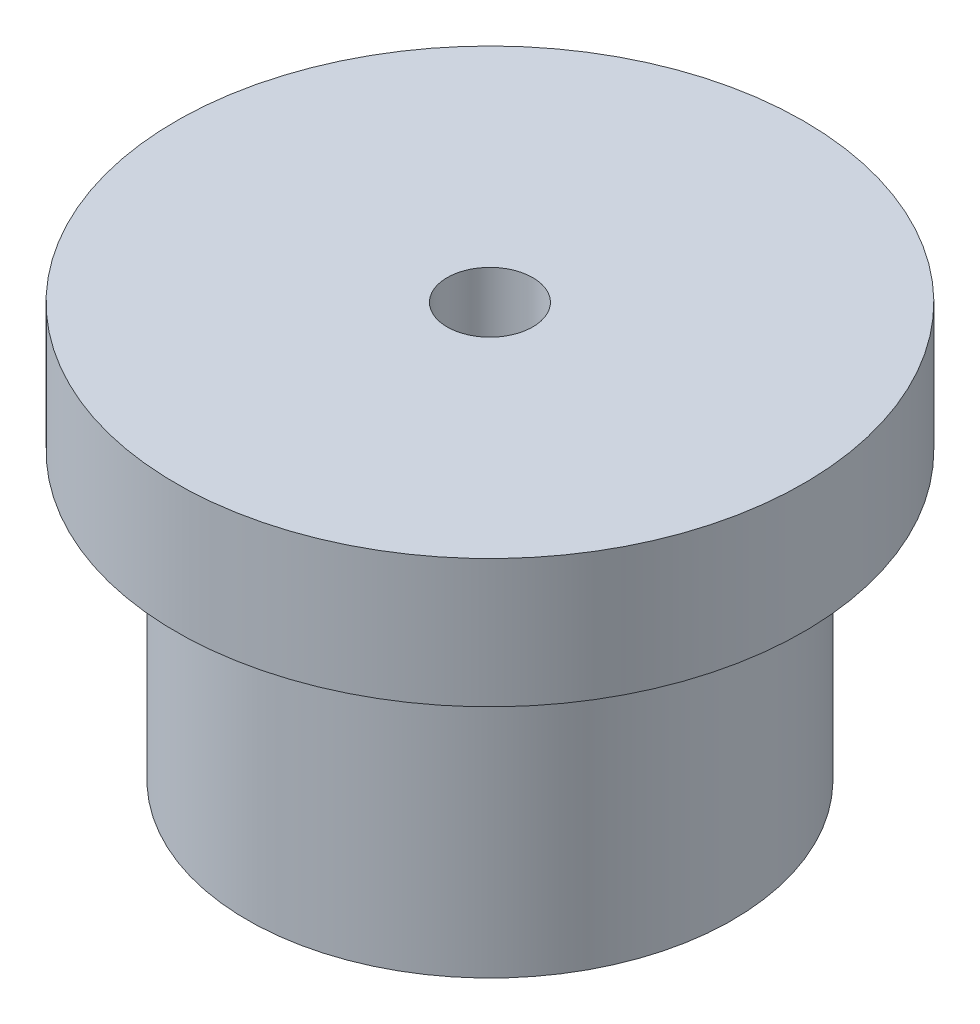
ISO-10303-21;
HEADER;
FILE_DESCRIPTION(('STEP AP214'),'2;1');
FILE_NAME('part.step','',(''),(''),'','','');
FILE_SCHEMA(('AUTOMOTIVE_DESIGN { 1 0 10303 214 1 1 1 1 }'));
ENDSEC;
DATA;
#1=APPLICATION_CONTEXT('core data for automotive mechanical design processes');
#2=APPLICATION_PROTOCOL_DEFINITION('international standard','automotive_design',2000,#1);
#3=PRODUCT_CONTEXT('',#1,'mechanical');
#4=PRODUCT('Part','Part','',(#3));
#5=PRODUCT_RELATED_PRODUCT_CATEGORY('part','',(#4));
#6=PRODUCT_DEFINITION_FORMATION('','',#4);
#7=PRODUCT_DEFINITION_CONTEXT('part definition',#1,'design');
#8=PRODUCT_DEFINITION('design','',#6,#7);
#9=PRODUCT_DEFINITION_SHAPE('','',#8);
#10=(LENGTH_UNIT() NAMED_UNIT(*) SI_UNIT(.MILLI.,.METRE.));
#11=(NAMED_UNIT(*) PLANE_ANGLE_UNIT() SI_UNIT($,.RADIAN.));
#12=(NAMED_UNIT(*) SI_UNIT($,.STERADIAN.) SOLID_ANGLE_UNIT());
#13=UNCERTAINTY_MEASURE_WITH_UNIT(LENGTH_MEASURE(1.E-05),#10,'distance_accuracy_value','');
#14=(GEOMETRIC_REPRESENTATION_CONTEXT(3) GLOBAL_UNCERTAINTY_ASSIGNED_CONTEXT((#13)) GLOBAL_UNIT_ASSIGNED_CONTEXT((#10,
#11,#12)) REPRESENTATION_CONTEXT('',''));
#15=CARTESIAN_POINT('',(0.,0.,0.));
#16=DIRECTION('',(0.,0.,1.));
#17=DIRECTION('',(1.,0.,0.));
#18=AXIS2_PLACEMENT_3D('',#15,#16,#17);
#19=CARTESIAN_POINT('',(0.,0.,0.));
#20=DIRECTION('',(0.,-1.,0.));
#21=DIRECTION('',(0.,0.,-1.));
#22=AXIS2_PLACEMENT_3D('',#19,#20,#21);
#23=CYLINDRICAL_SURFACE('',#22,15.);
#24=CARTESIAN_POINT('',(0.,-10.,0.));
#25=DIRECTION('',(0.,-1.,0.));
#26=DIRECTION('',(0.,0.,-1.));
#27=AXIS2_PLACEMENT_3D('',#24,#25,#26);
#28=CIRCLE('',#27,15.);
#29=CARTESIAN_POINT('',(0.,-10.,-15.));
#30=VERTEX_POINT('',#29);
#31=EDGE_CURVE('E10',#30,#30,#28,.T.);
#32=ORIENTED_EDGE('',*,*,#31,.T.);
#33=EDGE_LOOP('',(#32));
#34=FACE_BOUND('',#33,.T.);
#35=CARTESIAN_POINT('',(0.,135.,0.));
#36=DIRECTION('',(0.,-1.,0.));
#37=DIRECTION('',(0.,0.,-1.));
#38=AXIS2_PLACEMENT_3D('',#35,#36,#37);
#39=CIRCLE('',#38,15.);
#40=CARTESIAN_POINT('',(0.,135.,-15.));
#41=VERTEX_POINT('',#40);
#42=EDGE_CURVE('E58',#41,#41,#39,.T.);
#43=ORIENTED_EDGE('',*,*,#42,.F.);
#44=EDGE_LOOP('',(#43));
#45=FACE_BOUND('',#44,.T.);
#46=ADVANCED_FACE('F36',(#34,#45),#23,.F.);
#47=CARTESIAN_POINT('',(0.,-10.,0.));
#48=DIRECTION('',(0.,-1.,0.));
#49=DIRECTION('',(0.,0.,-1.));
#50=AXIS2_PLACEMENT_3D('',#47,#48,#49);
#51=PLANE('',#50);
#52=CARTESIAN_POINT('',(0.,-10.,0.));
#53=DIRECTION('',(0.,-1.,0.));
#54=DIRECTION('',(0.,0.,-1.));
#55=AXIS2_PLACEMENT_3D('',#52,#53,#54);
#56=CIRCLE('',#55,85.);
#57=CARTESIAN_POINT('',(0.,-10.,-85.));
#58=VERTEX_POINT('',#57);
#59=EDGE_CURVE('E42',#58,#58,#56,.T.);
#60=ORIENTED_EDGE('',*,*,#59,.T.);
#61=EDGE_LOOP('',(#60));
#62=FACE_BOUND('',#61,.T.);
#63=ORIENTED_EDGE('',*,*,#31,.F.);
#64=EDGE_LOOP('',(#63));
#65=FACE_BOUND('',#64,.T.);
#66=ADVANCED_FACE('F133',(#62,#65),#51,.T.);
#67=CARTESIAN_POINT('',(0.,0.,0.));
#68=DIRECTION('',(0.,-1.,0.));
#69=DIRECTION('',(0.,0.,-1.));
#70=AXIS2_PLACEMENT_3D('',#67,#68,#69);
#71=CYLINDRICAL_SURFACE('',#70,85.);
#72=CARTESIAN_POINT('',(0.,90.,0.));
#73=DIRECTION('',(0.,-1.,0.));
#74=DIRECTION('',(0.,0.,-1.));
#75=AXIS2_PLACEMENT_3D('',#72,#73,#74);
#76=CIRCLE('',#75,85.);
#77=CARTESIAN_POINT('',(0.,90.,-85.));
#78=VERTEX_POINT('',#77);
#79=EDGE_CURVE('E46',#78,#78,#76,.T.);
#80=ORIENTED_EDGE('',*,*,#79,.T.);
#81=EDGE_LOOP('',(#80));
#82=FACE_BOUND('',#81,.T.);
#83=ORIENTED_EDGE('',*,*,#59,.F.);
#84=EDGE_LOOP('',(#83));
#85=FACE_BOUND('',#84,.T.);
#86=ADVANCED_FACE('F130',(#82,#85),#71,.T.);
#87=CARTESIAN_POINT('',(0.,90.,0.));
#88=DIRECTION('',(0.,-1.,0.));
#89=DIRECTION('',(0.,0.,-1.));
#90=AXIS2_PLACEMENT_3D('',#87,#88,#89);
#91=PLANE('',#90);
#92=CARTESIAN_POINT('',(0.,90.,0.));
#93=DIRECTION('',(0.,-1.,0.));
#94=DIRECTION('',(0.,0.,-1.));
#95=AXIS2_PLACEMENT_3D('',#92,#93,#94);
#96=CIRCLE('',#95,110.);
#97=CARTESIAN_POINT('',(0.,90.,-110.));
#98=VERTEX_POINT('',#97);
#99=EDGE_CURVE('E50',#98,#98,#96,.T.);
#100=ORIENTED_EDGE('',*,*,#99,.T.);
#101=EDGE_LOOP('',(#100));
#102=FACE_BOUND('',#101,.T.);
#103=ORIENTED_EDGE('',*,*,#79,.F.);
#104=EDGE_LOOP('',(#103));
#105=FACE_BOUND('',#104,.T.);
#106=ADVANCED_FACE('F126',(#102,#105),#91,.T.);
#107=CARTESIAN_POINT('',(0.,0.,0.));
#108=DIRECTION('',(0.,-1.,0.));
#109=DIRECTION('',(0.,0.,-1.));
#110=AXIS2_PLACEMENT_3D('',#107,#108,#109);
#111=CYLINDRICAL_SURFACE('',#110,110.);
#112=CARTESIAN_POINT('',(0.,135.,0.));
#113=DIRECTION('',(0.,-1.,0.));
#114=DIRECTION('',(0.,0.,-1.));
#115=AXIS2_PLACEMENT_3D('',#112,#113,#114);
#116=CIRCLE('',#115,110.);
#117=CARTESIAN_POINT('',(0.,135.,-110.));
#118=VERTEX_POINT('',#117);
#119=EDGE_CURVE('E55',#118,#118,#116,.T.);
#120=ORIENTED_EDGE('',*,*,#119,.T.);
#121=EDGE_LOOP('',(#120));
#122=FACE_BOUND('',#121,.T.);
#123=ORIENTED_EDGE('',*,*,#99,.F.);
#124=EDGE_LOOP('',(#123));
#125=FACE_BOUND('',#124,.T.);
#126=ADVANCED_FACE('F122',(#122,#125),#111,.T.);
#127=CARTESIAN_POINT('',(0.,135.,0.));
#128=DIRECTION('',(0.,1.,0.));
#129=DIRECTION('',(0.,0.,1.));
#130=AXIS2_PLACEMENT_3D('',#127,#128,#129);
#131=PLANE('',#130);
#132=ORIENTED_EDGE('',*,*,#42,.T.);
#133=EDGE_LOOP('',(#132));
#134=FACE_BOUND('',#133,.T.);
#135=ORIENTED_EDGE('',*,*,#119,.F.);
#136=EDGE_LOOP('',(#135));
#137=FACE_BOUND('',#136,.T.);
#138=ADVANCED_FACE('F120',(#134,#137),#131,.T.);
#139=CLOSED_SHELL('',(#46,#66,#86,#106,#126,#138));
#140=CARTESIAN_POINT('',(0.,0.,0.));
#141=DIRECTION('',(0.,-1.,0.));
#142=DIRECTION('',(0.,0.,-1.));
#143=AXIS2_PLACEMENT_3D('',#140,#141,#142);
#144=CYLINDRICAL_SURFACE('',#143,25.);
#145=CARTESIAN_POINT('',(0.,0.,0.));
#146=DIRECTION('',(0.,-1.,0.));
#147=DIRECTION('',(0.,0.,-1.));
#148=AXIS2_PLACEMENT_3D('',#145,#146,#147);
#149=CIRCLE('',#148,25.);
#150=CARTESIAN_POINT('',(0.,0.,-25.));
#151=VERTEX_POINT('',#150);
#152=EDGE_CURVE('E61',#151,#151,#149,.T.);
#153=ORIENTED_EDGE('',*,*,#152,.F.);
#154=EDGE_LOOP('',(#153));
#155=FACE_BOUND('',#154,.T.);
#156=CARTESIAN_POINT('',(0.,125.,0.));
#157=DIRECTION('',(0.,-1.,0.));
#158=DIRECTION('',(0.,0.,-1.));
#159=AXIS2_PLACEMENT_3D('',#156,#157,#158);
#160=CIRCLE('',#159,25.);
#161=CARTESIAN_POINT('',(0.,125.,-25.));
#162=VERTEX_POINT('',#161);
#163=EDGE_CURVE('E76',#162,#162,#160,.T.);
#164=ORIENTED_EDGE('',*,*,#163,.T.);
#165=EDGE_LOOP('',(#164));
#166=FACE_BOUND('',#165,.T.);
#167=ADVANCED_FACE('F80',(#155,#166),#144,.T.);
#168=CARTESIAN_POINT('',(0.,0.,0.));
#169=DIRECTION('',(0.,-1.,0.));
#170=DIRECTION('',(0.,0.,-1.));
#171=AXIS2_PLACEMENT_3D('',#168,#169,#170);
#172=PLANE('',#171);
#173=CARTESIAN_POINT('',(0.,0.,0.));
#174=DIRECTION('',(0.,-1.,0.));
#175=DIRECTION('',(0.,0.,-1.));
#176=AXIS2_PLACEMENT_3D('',#173,#174,#175);
#177=CIRCLE('',#176,75.);
#178=CARTESIAN_POINT('',(0.,0.,-75.));
#179=VERTEX_POINT('',#178);
#180=EDGE_CURVE('E64',#179,#179,#177,.T.);
#181=ORIENTED_EDGE('',*,*,#180,.F.);
#182=EDGE_LOOP('',(#181));
#183=FACE_BOUND('',#182,.T.);
#184=ORIENTED_EDGE('',*,*,#152,.T.);
#185=EDGE_LOOP('',(#184));
#186=FACE_BOUND('',#185,.T.);
#187=ADVANCED_FACE('F104',(#183,#186),#172,.F.);
#188=CARTESIAN_POINT('',(0.,0.,0.));
#189=DIRECTION('',(0.,-1.,0.));
#190=DIRECTION('',(0.,0.,-1.));
#191=AXIS2_PLACEMENT_3D('',#188,#189,#190);
#192=CYLINDRICAL_SURFACE('',#191,75.);
#193=CARTESIAN_POINT('',(0.,100.,0.));
#194=DIRECTION('',(0.,-1.,0.));
#195=DIRECTION('',(0.,0.,-1.));
#196=AXIS2_PLACEMENT_3D('',#193,#194,#195);
#197=CIRCLE('',#196,75.);
#198=CARTESIAN_POINT('',(0.,100.,-75.));
#199=VERTEX_POINT('',#198);
#200=EDGE_CURVE('E67',#199,#199,#197,.T.);
#201=ORIENTED_EDGE('',*,*,#200,.F.);
#202=EDGE_LOOP('',(#201));
#203=FACE_BOUND('',#202,.T.);
#204=ORIENTED_EDGE('',*,*,#180,.T.);
#205=EDGE_LOOP('',(#204));
#206=FACE_BOUND('',#205,.T.);
#207=ADVANCED_FACE('F98',(#203,#206),#192,.F.);
#208=CARTESIAN_POINT('',(-1.11022302462516E-13,100.,0.));
#209=DIRECTION('',(0.,-1.,0.));
#210=DIRECTION('',(0.,0.,-1.));
#211=AXIS2_PLACEMENT_3D('',#208,#209,#210);
#212=PLANE('',#211);
#213=CARTESIAN_POINT('',(0.,100.,0.));
#214=DIRECTION('',(0.,-1.,0.));
#215=DIRECTION('',(0.,0.,-1.));
#216=AXIS2_PLACEMENT_3D('',#213,#214,#215);
#217=CIRCLE('',#216,100.);
#218=CARTESIAN_POINT('',(0.,100.,-100.));
#219=VERTEX_POINT('',#218);
#220=EDGE_CURVE('E70',#219,#219,#217,.T.);
#221=ORIENTED_EDGE('',*,*,#220,.F.);
#222=EDGE_LOOP('',(#221));
#223=FACE_BOUND('',#222,.T.);
#224=ORIENTED_EDGE('',*,*,#200,.T.);
#225=EDGE_LOOP('',(#224));
#226=FACE_BOUND('',#225,.T.);
#227=ADVANCED_FACE('F92',(#223,#226),#212,.F.);
#228=CARTESIAN_POINT('',(0.,0.,0.));
#229=DIRECTION('',(0.,-1.,0.));
#230=DIRECTION('',(0.,0.,-1.));
#231=AXIS2_PLACEMENT_3D('',#228,#229,#230);
#232=CYLINDRICAL_SURFACE('',#231,100.);
#233=CARTESIAN_POINT('',(0.,125.,0.));
#234=DIRECTION('',(0.,-1.,0.));
#235=DIRECTION('',(0.,0.,-1.));
#236=AXIS2_PLACEMENT_3D('',#233,#234,#235);
#237=CIRCLE('',#236,100.);
#238=CARTESIAN_POINT('',(0.,125.,-100.));
#239=VERTEX_POINT('',#238);
#240=EDGE_CURVE('E73',#239,#239,#237,.T.);
#241=ORIENTED_EDGE('',*,*,#240,.F.);
#242=EDGE_LOOP('',(#241));
#243=FACE_BOUND('',#242,.T.);
#244=ORIENTED_EDGE('',*,*,#220,.T.);
#245=EDGE_LOOP('',(#244));
#246=FACE_BOUND('',#245,.T.);
#247=ADVANCED_FACE('F85',(#243,#246),#232,.F.);
#248=CARTESIAN_POINT('',(0.,125.,0.));
#249=DIRECTION('',(0.,1.,0.));
#250=DIRECTION('',(0.,0.,1.));
#251=AXIS2_PLACEMENT_3D('',#248,#249,#250);
#252=PLANE('',#251);
#253=ORIENTED_EDGE('',*,*,#163,.F.);
#254=EDGE_LOOP('',(#253));
#255=FACE_BOUND('',#254,.T.);
#256=ORIENTED_EDGE('',*,*,#240,.T.);
#257=EDGE_LOOP('',(#256));
#258=FACE_BOUND('',#257,.T.);
#259=ADVANCED_FACE('F82',(#255,#258),#252,.F.);
#260=CLOSED_SHELL('',(#167,#187,#207,#227,#247,#259));
#261=ORIENTED_CLOSED_SHELL('',*,#260,.T.);
#262=BREP_WITH_VOIDS('B2',#139,(#261));
#263=ADVANCED_BREP_SHAPE_REPRESENTATION('',(#18,#262),#14);
#264=SHAPE_DEFINITION_REPRESENTATION(#9,#263);
ENDSEC;
END-ISO-10303-21;
